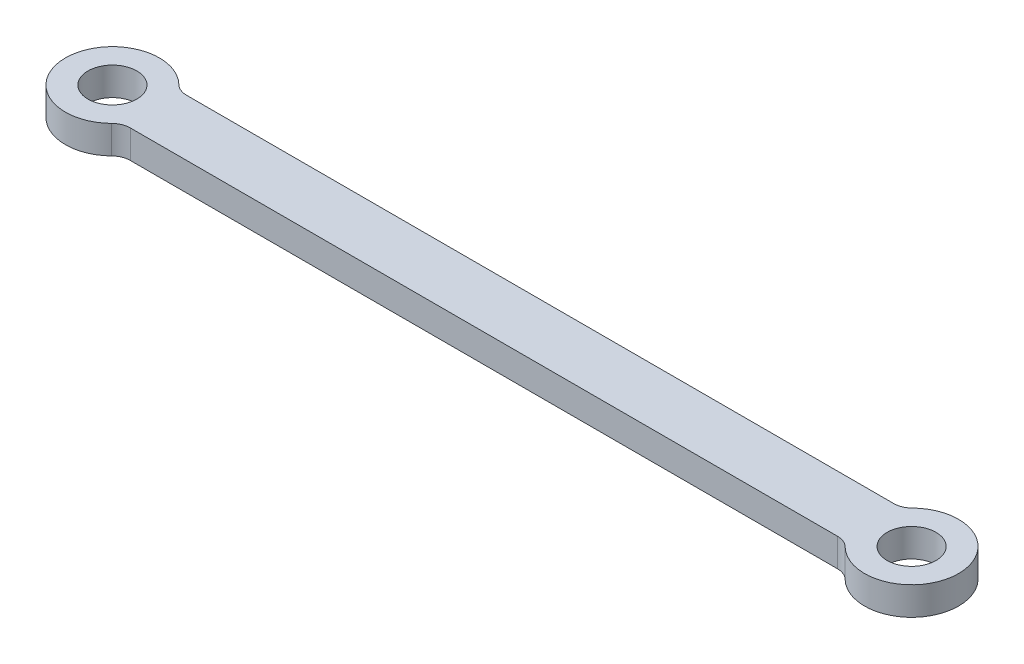
ISO-10303-21;
HEADER;
FILE_DESCRIPTION(('STEP AP214'),'2;1');
FILE_NAME('part.step','',(''),(''),'','','');
FILE_SCHEMA(('AUTOMOTIVE_DESIGN { 1 0 10303 214 1 1 1 1 }'));
ENDSEC;
DATA;
#1=APPLICATION_CONTEXT('core data for automotive mechanical design processes');
#2=APPLICATION_PROTOCOL_DEFINITION('international standard','automotive_design',2000,#1);
#3=PRODUCT_CONTEXT('',#1,'mechanical');
#4=PRODUCT('Part','Part','',(#3));
#5=PRODUCT_RELATED_PRODUCT_CATEGORY('part','',(#4));
#6=PRODUCT_DEFINITION_FORMATION('','',#4);
#7=PRODUCT_DEFINITION_CONTEXT('part definition',#1,'design');
#8=PRODUCT_DEFINITION('design','',#6,#7);
#9=PRODUCT_DEFINITION_SHAPE('','',#8);
#10=(LENGTH_UNIT() NAMED_UNIT(*) SI_UNIT(.MILLI.,.METRE.));
#11=(NAMED_UNIT(*) PLANE_ANGLE_UNIT() SI_UNIT($,.RADIAN.));
#12=(NAMED_UNIT(*) SI_UNIT($,.STERADIAN.) SOLID_ANGLE_UNIT());
#13=UNCERTAINTY_MEASURE_WITH_UNIT(LENGTH_MEASURE(1.E-05),#10,'distance_accuracy_value','');
#14=(GEOMETRIC_REPRESENTATION_CONTEXT(3) GLOBAL_UNCERTAINTY_ASSIGNED_CONTEXT((#13)) GLOBAL_UNIT_ASSIGNED_CONTEXT((#10,
#11,#12)) REPRESENTATION_CONTEXT('',''));
#15=CARTESIAN_POINT('',(0.,0.,0.));
#16=DIRECTION('',(0.,0.,1.));
#17=DIRECTION('',(1.,0.,0.));
#18=AXIS2_PLACEMENT_3D('',#15,#16,#17);
#19=CARTESIAN_POINT('',(-42.5,3.,3.00000000000002));
#20=DIRECTION('',(0.,0.,-1.));
#21=DIRECTION('',(-1.,0.,0.));
#22=AXIS2_PLACEMENT_3D('',#19,#20,#21);
#23=PLANE('',#22);
#24=DIRECTION('',(1.,0.,0.));
#25=VECTOR('',#24,1.);
#26=CARTESIAN_POINT('',(-42.5,0.,3.00000000000002));
#27=LINE('',#26,#25);
#28=CARTESIAN_POINT('',(-37.6010205144337,0.,3.00000000000002));
#29=VERTEX_POINT('',#28);
#30=CARTESIAN_POINT('',(37.6010205144337,0.,3.));
#31=VERTEX_POINT('',#30);
#32=EDGE_CURVE('E116',#29,#31,#27,.T.);
#33=ORIENTED_EDGE('',*,*,#32,.T.);
#34=DIRECTION('',(0.,1.,0.));
#35=VECTOR('',#34,1.);
#36=CARTESIAN_POINT('',(37.6010205144337,3.,3.));
#37=LINE('',#36,#35);
#38=CARTESIAN_POINT('',(37.6010205144337,3.,3.));
#39=VERTEX_POINT('',#38);
#40=EDGE_CURVE('E120',#31,#39,#37,.T.);
#41=ORIENTED_EDGE('',*,*,#40,.T.);
#42=DIRECTION('',(1.,0.,0.));
#43=VECTOR('',#42,1.);
#44=CARTESIAN_POINT('',(-42.5,3.,3.00000000000002));
#45=LINE('',#44,#43);
#46=CARTESIAN_POINT('',(-37.6010205144337,3.,3.00000000000002));
#47=VERTEX_POINT('',#46);
#48=EDGE_CURVE('E119',#47,#39,#45,.T.);
#49=ORIENTED_EDGE('',*,*,#48,.F.);
#50=DIRECTION('',(0.,1.,0.));
#51=VECTOR('',#50,1.);
#52=CARTESIAN_POINT('',(-37.6010205144337,3.,3.00000000000002));
#53=LINE('',#52,#51);
#54=EDGE_CURVE('E105',#47,#29,#53,.F.);
#55=ORIENTED_EDGE('',*,*,#54,.T.);
#56=EDGE_LOOP('',(#33,#41,#49,#55));
#57=FACE_BOUND('',#56,.T.);
#58=ADVANCED_FACE('F35',(#57),#23,.F.);
#59=CARTESIAN_POINT('',(-42.5,3.,-3.00000000000002));
#60=DIRECTION('',(0.,0.,1.));
#61=DIRECTION('',(1.,0.,0.));
#62=AXIS2_PLACEMENT_3D('',#59,#60,#61);
#63=PLANE('',#62);
#64=DIRECTION('',(-1.,0.,0.));
#65=VECTOR('',#64,1.);
#66=CARTESIAN_POINT('',(-42.5,3.,-3.00000000000002));
#67=LINE('',#66,#65);
#68=CARTESIAN_POINT('',(37.6010205144337,3.,-3.00000000000003));
#69=VERTEX_POINT('',#68);
#70=CARTESIAN_POINT('',(-37.6010205144337,3.,-3.00000000000002));
#71=VERTEX_POINT('',#70);
#72=EDGE_CURVE('E121',#69,#71,#67,.T.);
#73=ORIENTED_EDGE('',*,*,#72,.F.);
#74=DIRECTION('',(0.,1.,0.));
#75=VECTOR('',#74,1.);
#76=CARTESIAN_POINT('',(37.6010205144337,3.,-3.00000000000003));
#77=LINE('',#76,#75);
#78=CARTESIAN_POINT('',(37.6010205144337,0.,-3.00000000000003));
#79=VERTEX_POINT('',#78);
#80=EDGE_CURVE('E154',#69,#79,#77,.F.);
#81=ORIENTED_EDGE('',*,*,#80,.T.);
#82=DIRECTION('',(-1.,0.,0.));
#83=VECTOR('',#82,1.);
#84=CARTESIAN_POINT('',(-42.5,0.,-3.00000000000002));
#85=LINE('',#84,#83);
#86=CARTESIAN_POINT('',(-37.6010205144337,0.,-3.00000000000002));
#87=VERTEX_POINT('',#86);
#88=EDGE_CURVE('E126',#79,#87,#85,.T.);
#89=ORIENTED_EDGE('',*,*,#88,.T.);
#90=DIRECTION('',(0.,1.,0.));
#91=VECTOR('',#90,1.);
#92=CARTESIAN_POINT('',(-37.6010205144337,3.,-3.00000000000002));
#93=LINE('',#92,#91);
#94=EDGE_CURVE('E151',#87,#71,#93,.T.);
#95=ORIENTED_EDGE('',*,*,#94,.T.);
#96=EDGE_LOOP('',(#73,#81,#89,#95));
#97=FACE_BOUND('',#96,.T.);
#98=ADVANCED_FACE('F176',(#97),#63,.F.);
#99=CARTESIAN_POINT('',(-42.5,3.,0.));
#100=DIRECTION('',(0.,1.,0.));
#101=DIRECTION('',(0.,0.,1.));
#102=AXIS2_PLACEMENT_3D('',#99,#100,#101);
#103=PLANE('',#102);
#104=CARTESIAN_POINT('',(-42.5,3.,0.));
#105=DIRECTION('',(0.,1.,0.));
#106=DIRECTION('',(0.,0.,1.));
#107=AXIS2_PLACEMENT_3D('',#104,#105,#106);
#108=CIRCLE('',#107,2.6);
#109=CARTESIAN_POINT('',(-42.5,3.,2.6));
#110=VERTEX_POINT('',#109);
#111=EDGE_CURVE('E139',#110,#110,#108,.T.);
#112=ORIENTED_EDGE('',*,*,#111,.F.);
#113=EDGE_LOOP('',(#112));
#114=FACE_BOUND('',#113,.T.);
#115=CARTESIAN_POINT('',(42.5,3.,0.));
#116=DIRECTION('',(0.,1.,0.));
#117=DIRECTION('',(0.,0.,1.));
#118=AXIS2_PLACEMENT_3D('',#115,#116,#117);
#119=CIRCLE('',#118,2.6);
#120=CARTESIAN_POINT('',(42.5,3.,2.59999999999998));
#121=VERTEX_POINT('',#120);
#122=EDGE_CURVE('E188',#121,#121,#119,.T.);
#123=ORIENTED_EDGE('',*,*,#122,.F.);
#124=EDGE_LOOP('',(#123));
#125=FACE_BOUND('',#124,.T.);
#126=CARTESIAN_POINT('',(-42.5,3.,0.));
#127=DIRECTION('',(0.,1.,0.));
#128=DIRECTION('',(0.,0.,1.));
#129=AXIS2_PLACEMENT_3D('',#126,#127,#128);
#130=CIRCLE('',#129,5.);
#131=CARTESIAN_POINT('',(-39.0007289388812,3.,-3.57142857142858));
#132=VERTEX_POINT('',#131);
#133=CARTESIAN_POINT('',(-39.0007289388812,3.,3.57142857142858));
#134=VERTEX_POINT('',#133);
#135=EDGE_CURVE('E130',#132,#134,#130,.T.);
#136=ORIENTED_EDGE('',*,*,#135,.T.);
#137=CARTESIAN_POINT('',(-37.6010205144337,3.,5.00000000000002));
#138=DIRECTION('',(0.,1.,0.));
#139=DIRECTION('',(0.,0.,1.));
#140=AXIS2_PLACEMENT_3D('',#137,#138,#139);
#141=CIRCLE('',#140,2.);
#142=EDGE_CURVE('E109',#134,#47,#141,.F.);
#143=ORIENTED_EDGE('',*,*,#142,.T.);
#144=ORIENTED_EDGE('',*,*,#48,.T.);
#145=CARTESIAN_POINT('',(37.6010205144337,3.,5.));
#146=DIRECTION('',(0.,1.,0.));
#147=DIRECTION('',(0.,0.,1.));
#148=AXIS2_PLACEMENT_3D('',#145,#146,#147);
#149=CIRCLE('',#148,2.);
#150=CARTESIAN_POINT('',(39.0007289388812,3.,3.57142857142857));
#151=VERTEX_POINT('',#150);
#152=EDGE_CURVE('E156',#39,#151,#149,.F.);
#153=ORIENTED_EDGE('',*,*,#152,.T.);
#154=CARTESIAN_POINT('',(42.5,3.,0.));
#155=DIRECTION('',(0.,1.,0.));
#156=DIRECTION('',(0.,0.,1.));
#157=AXIS2_PLACEMENT_3D('',#154,#155,#156);
#158=CIRCLE('',#157,5.);
#159=CARTESIAN_POINT('',(39.0007289388812,3.,-3.5714285714286));
#160=VERTEX_POINT('',#159);
#161=EDGE_CURVE('E141',#151,#160,#158,.T.);
#162=ORIENTED_EDGE('',*,*,#161,.T.);
#163=CARTESIAN_POINT('',(37.6010205144337,3.,-5.00000000000003));
#164=DIRECTION('',(0.,1.,0.));
#165=DIRECTION('',(0.,0.,1.));
#166=AXIS2_PLACEMENT_3D('',#163,#164,#165);
#167=CIRCLE('',#166,2.);
#168=EDGE_CURVE('E161',#160,#69,#167,.F.);
#169=ORIENTED_EDGE('',*,*,#168,.T.);
#170=ORIENTED_EDGE('',*,*,#72,.T.);
#171=CARTESIAN_POINT('',(-37.6010205144337,3.,-5.00000000000002));
#172=DIRECTION('',(0.,1.,0.));
#173=DIRECTION('',(0.,0.,1.));
#174=AXIS2_PLACEMENT_3D('',#171,#172,#173);
#175=CIRCLE('',#174,2.);
#176=EDGE_CURVE('E43',#71,#132,#175,.F.);
#177=ORIENTED_EDGE('',*,*,#176,.T.);
#178=EDGE_LOOP('',(#136,#143,#144,#153,#162,#169,#170,#177));
#179=FACE_BOUND('',#178,.T.);
#180=ADVANCED_FACE('F166',(#114,#125,#179),#103,.T.);
#181=CARTESIAN_POINT('',(-42.5,0.,0.));
#182=DIRECTION('',(0.,1.,0.));
#183=DIRECTION('',(0.,0.,1.));
#184=AXIS2_PLACEMENT_3D('',#181,#182,#183);
#185=PLANE('',#184);
#186=CARTESIAN_POINT('',(-42.5,0.,0.));
#187=DIRECTION('',(0.,1.,0.));
#188=DIRECTION('',(0.,0.,1.));
#189=AXIS2_PLACEMENT_3D('',#186,#187,#188);
#190=CIRCLE('',#189,2.6);
#191=CARTESIAN_POINT('',(-42.5,0.,2.6));
#192=VERTEX_POINT('',#191);
#193=EDGE_CURVE('E138',#192,#192,#190,.T.);
#194=ORIENTED_EDGE('',*,*,#193,.T.);
#195=EDGE_LOOP('',(#194));
#196=FACE_BOUND('',#195,.T.);
#197=CARTESIAN_POINT('',(42.5,0.,0.));
#198=DIRECTION('',(0.,1.,0.));
#199=DIRECTION('',(0.,0.,1.));
#200=AXIS2_PLACEMENT_3D('',#197,#198,#199);
#201=CIRCLE('',#200,2.6);
#202=CARTESIAN_POINT('',(42.5,0.,2.59999999999998));
#203=VERTEX_POINT('',#202);
#204=EDGE_CURVE('E135',#203,#203,#201,.T.);
#205=ORIENTED_EDGE('',*,*,#204,.T.);
#206=EDGE_LOOP('',(#205));
#207=FACE_BOUND('',#206,.T.);
#208=ORIENTED_EDGE('',*,*,#88,.F.);
#209=CARTESIAN_POINT('',(37.6010205144337,0.,-5.00000000000003));
#210=DIRECTION('',(0.,1.,0.));
#211=DIRECTION('',(0.,0.,1.));
#212=AXIS2_PLACEMENT_3D('',#209,#210,#211);
#213=CIRCLE('',#212,2.);
#214=CARTESIAN_POINT('',(39.0007289388812,0.,-3.5714285714286));
#215=VERTEX_POINT('',#214);
#216=EDGE_CURVE('E56',#79,#215,#213,.T.);
#217=ORIENTED_EDGE('',*,*,#216,.T.);
#218=CARTESIAN_POINT('',(42.5,0.,0.));
#219=DIRECTION('',(0.,1.,0.));
#220=DIRECTION('',(0.,0.,1.));
#221=AXIS2_PLACEMENT_3D('',#218,#219,#220);
#222=CIRCLE('',#221,5.);
#223=CARTESIAN_POINT('',(39.0007289388812,0.,3.57142857142857));
#224=VERTEX_POINT('',#223);
#225=EDGE_CURVE('E173',#215,#224,#222,.F.);
#226=ORIENTED_EDGE('',*,*,#225,.T.);
#227=CARTESIAN_POINT('',(37.6010205144337,0.,5.));
#228=DIRECTION('',(0.,1.,0.));
#229=DIRECTION('',(0.,0.,1.));
#230=AXIS2_PLACEMENT_3D('',#227,#228,#229);
#231=CIRCLE('',#230,2.);
#232=EDGE_CURVE('E110',#224,#31,#231,.T.);
#233=ORIENTED_EDGE('',*,*,#232,.T.);
#234=ORIENTED_EDGE('',*,*,#32,.F.);
#235=CARTESIAN_POINT('',(-37.6010205144337,0.,5.00000000000002));
#236=DIRECTION('',(0.,1.,0.));
#237=DIRECTION('',(0.,0.,1.));
#238=AXIS2_PLACEMENT_3D('',#235,#236,#237);
#239=CIRCLE('',#238,2.);
#240=CARTESIAN_POINT('',(-39.0007289388812,0.,3.57142857142858));
#241=VERTEX_POINT('',#240);
#242=EDGE_CURVE('E101',#29,#241,#239,.T.);
#243=ORIENTED_EDGE('',*,*,#242,.T.);
#244=CARTESIAN_POINT('',(-42.5,0.,0.));
#245=DIRECTION('',(0.,1.,0.));
#246=DIRECTION('',(0.,0.,1.));
#247=AXIS2_PLACEMENT_3D('',#244,#245,#246);
#248=CIRCLE('',#247,5.);
#249=CARTESIAN_POINT('',(-39.0007289388812,0.,-3.57142857142858));
#250=VERTEX_POINT('',#249);
#251=EDGE_CURVE('E127',#241,#250,#248,.F.);
#252=ORIENTED_EDGE('',*,*,#251,.T.);
#253=CARTESIAN_POINT('',(-37.6010205144337,0.,-5.00000000000002));
#254=DIRECTION('',(0.,1.,0.));
#255=DIRECTION('',(0.,0.,1.));
#256=AXIS2_PLACEMENT_3D('',#253,#254,#255);
#257=CIRCLE('',#256,2.);
#258=EDGE_CURVE('E11',#250,#87,#257,.T.);
#259=ORIENTED_EDGE('',*,*,#258,.T.);
#260=EDGE_LOOP('',(#208,#217,#226,#233,#234,#243,#252,#259));
#261=FACE_BOUND('',#260,.T.);
#262=ADVANCED_FACE('F123',(#196,#207,#261),#185,.F.);
#263=CARTESIAN_POINT('',(-42.5,-14.1421356237309,0.));
#264=DIRECTION('',(0.,1.,0.));
#265=DIRECTION('',(0.,0.,1.));
#266=AXIS2_PLACEMENT_3D('',#263,#264,#265);
#267=CYLINDRICAL_SURFACE('',#266,5.);
#268=ORIENTED_EDGE('',*,*,#251,.F.);
#269=DIRECTION('',(0.,1.,0.));
#270=VECTOR('',#269,1.);
#271=CARTESIAN_POINT('',(-39.0007289388812,-14.1421356237309,3.57142857142858));
#272=LINE('',#271,#270);
#273=EDGE_CURVE('E106',#241,#134,#272,.T.);
#274=ORIENTED_EDGE('',*,*,#273,.T.);
#275=ORIENTED_EDGE('',*,*,#135,.F.);
#276=DIRECTION('',(0.,1.,0.));
#277=VECTOR('',#276,1.);
#278=CARTESIAN_POINT('',(-39.0007289388812,-14.1421356237309,-3.57142857142858));
#279=LINE('',#278,#277);
#280=EDGE_CURVE('E148',#132,#250,#279,.F.);
#281=ORIENTED_EDGE('',*,*,#280,.T.);
#282=EDGE_LOOP('',(#268,#274,#275,#281));
#283=FACE_BOUND('',#282,.T.);
#284=ADVANCED_FACE('F172',(#283),#267,.T.);
#285=CARTESIAN_POINT('',(42.5,-14.1421356237309,0.));
#286=DIRECTION('',(0.,1.,0.));
#287=DIRECTION('',(0.,0.,1.));
#288=AXIS2_PLACEMENT_3D('',#285,#286,#287);
#289=CYLINDRICAL_SURFACE('',#288,5.);
#290=ORIENTED_EDGE('',*,*,#161,.F.);
#291=DIRECTION('',(0.,1.,0.));
#292=VECTOR('',#291,1.);
#293=CARTESIAN_POINT('',(39.0007289388812,-14.1421356237309,3.57142857142857));
#294=LINE('',#293,#292);
#295=EDGE_CURVE('E146',#151,#224,#294,.F.);
#296=ORIENTED_EDGE('',*,*,#295,.T.);
#297=ORIENTED_EDGE('',*,*,#225,.F.);
#298=DIRECTION('',(0.,1.,0.));
#299=VECTOR('',#298,1.);
#300=CARTESIAN_POINT('',(39.0007289388812,-14.1421356237309,-3.5714285714286));
#301=LINE('',#300,#299);
#302=EDGE_CURVE('E144',#215,#160,#301,.T.);
#303=ORIENTED_EDGE('',*,*,#302,.T.);
#304=EDGE_LOOP('',(#290,#296,#297,#303));
#305=FACE_BOUND('',#304,.T.);
#306=ADVANCED_FACE('F180',(#305),#289,.T.);
#307=CARTESIAN_POINT('',(42.5,-7.,0.));
#308=DIRECTION('',(0.,1.,0.));
#309=DIRECTION('',(0.,0.,1.));
#310=AXIS2_PLACEMENT_3D('',#307,#308,#309);
#311=CYLINDRICAL_SURFACE('',#310,2.6);
#312=ORIENTED_EDGE('',*,*,#122,.T.);
#313=EDGE_LOOP('',(#312));
#314=FACE_BOUND('',#313,.T.);
#315=ORIENTED_EDGE('',*,*,#204,.F.);
#316=EDGE_LOOP('',(#315));
#317=FACE_BOUND('',#316,.T.);
#318=ADVANCED_FACE('F202',(#314,#317),#311,.F.);
#319=CARTESIAN_POINT('',(-42.5,-7.,0.));
#320=DIRECTION('',(0.,1.,0.));
#321=DIRECTION('',(0.,0.,1.));
#322=AXIS2_PLACEMENT_3D('',#319,#320,#321);
#323=CYLINDRICAL_SURFACE('',#322,2.6);
#324=ORIENTED_EDGE('',*,*,#111,.T.);
#325=EDGE_LOOP('',(#324));
#326=FACE_BOUND('',#325,.T.);
#327=ORIENTED_EDGE('',*,*,#193,.F.);
#328=EDGE_LOOP('',(#327));
#329=FACE_BOUND('',#328,.T.);
#330=ADVANCED_FACE('F194',(#326,#329),#323,.F.);
#331=CARTESIAN_POINT('',(37.6010205144337,-14.1421356237309,5.));
#332=DIRECTION('',(0.,1.,0.));
#333=DIRECTION('',(0.,0.,1.));
#334=AXIS2_PLACEMENT_3D('',#331,#332,#333);
#335=CYLINDRICAL_SURFACE('',#334,2.);
#336=ORIENTED_EDGE('',*,*,#232,.F.);
#337=ORIENTED_EDGE('',*,*,#295,.F.);
#338=ORIENTED_EDGE('',*,*,#152,.F.);
#339=ORIENTED_EDGE('',*,*,#40,.F.);
#340=EDGE_LOOP('',(#336,#337,#338,#339));
#341=FACE_BOUND('',#340,.T.);
#342=ADVANCED_FACE('F222',(#341),#335,.F.);
#343=CARTESIAN_POINT('',(-37.6010205144337,-14.1421356237309,5.00000000000002));
#344=DIRECTION('',(0.,1.,0.));
#345=DIRECTION('',(0.,0.,1.));
#346=AXIS2_PLACEMENT_3D('',#343,#344,#345);
#347=CYLINDRICAL_SURFACE('',#346,2.);
#348=ORIENTED_EDGE('',*,*,#142,.F.);
#349=ORIENTED_EDGE('',*,*,#273,.F.);
#350=ORIENTED_EDGE('',*,*,#242,.F.);
#351=ORIENTED_EDGE('',*,*,#54,.F.);
#352=EDGE_LOOP('',(#348,#349,#350,#351));
#353=FACE_BOUND('',#352,.T.);
#354=ADVANCED_FACE('F104',(#353),#347,.F.);
#355=CARTESIAN_POINT('',(37.6010205144337,-14.1421356237309,-5.00000000000003));
#356=DIRECTION('',(0.,1.,0.));
#357=DIRECTION('',(0.,0.,1.));
#358=AXIS2_PLACEMENT_3D('',#355,#356,#357);
#359=CYLINDRICAL_SURFACE('',#358,2.);
#360=ORIENTED_EDGE('',*,*,#168,.F.);
#361=ORIENTED_EDGE('',*,*,#302,.F.);
#362=ORIENTED_EDGE('',*,*,#216,.F.);
#363=ORIENTED_EDGE('',*,*,#80,.F.);
#364=EDGE_LOOP('',(#360,#361,#362,#363));
#365=FACE_BOUND('',#364,.T.);
#366=ADVANCED_FACE('F185',(#365),#359,.F.);
#367=CARTESIAN_POINT('',(-37.6010205144337,-14.1421356237309,-5.00000000000002));
#368=DIRECTION('',(0.,1.,0.));
#369=DIRECTION('',(0.,0.,1.));
#370=AXIS2_PLACEMENT_3D('',#367,#368,#369);
#371=CYLINDRICAL_SURFACE('',#370,2.);
#372=ORIENTED_EDGE('',*,*,#258,.F.);
#373=ORIENTED_EDGE('',*,*,#280,.F.);
#374=ORIENTED_EDGE('',*,*,#176,.F.);
#375=ORIENTED_EDGE('',*,*,#94,.F.);
#376=EDGE_LOOP('',(#372,#373,#374,#375));
#377=FACE_BOUND('',#376,.T.);
#378=ADVANCED_FACE('F37',(#377),#371,.F.);
#379=CLOSED_SHELL('',(#58,#98,#180,#262,#284,#306,#318,#330,#342,#354,#366,#378));
#380=MANIFOLD_SOLID_BREP('B2',#379);
#381=ADVANCED_BREP_SHAPE_REPRESENTATION('',(#18,#380),#14);
#382=SHAPE_DEFINITION_REPRESENTATION(#9,#381);
ENDSEC;
END-ISO-10303-21;
